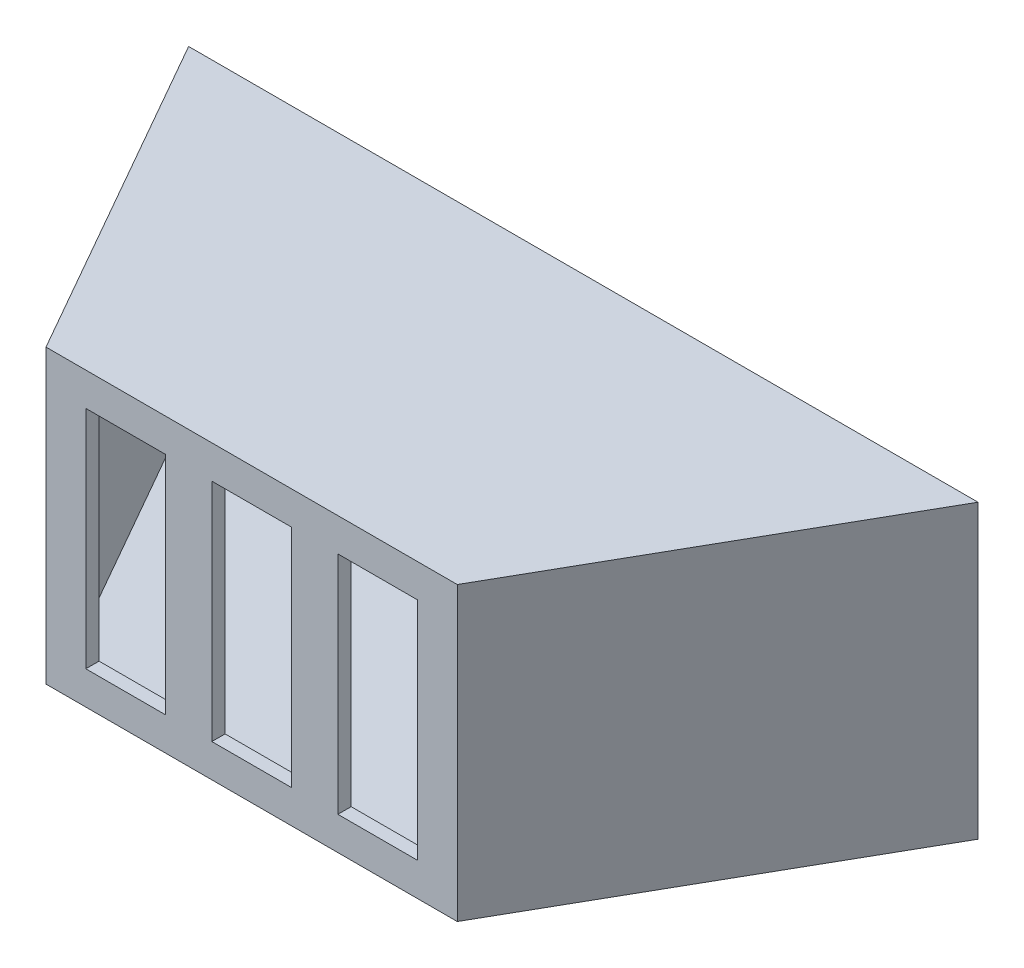
ISO-10303-21;
HEADER;
FILE_DESCRIPTION(('STEP AP214'),'2;1');
FILE_NAME('part.step','',(''),(''),'','','');
FILE_SCHEMA(('AUTOMOTIVE_DESIGN { 1 0 10303 214 1 1 1 1 }'));
ENDSEC;
DATA;
#1=APPLICATION_CONTEXT('core data for automotive mechanical design processes');
#2=APPLICATION_PROTOCOL_DEFINITION('international standard','automotive_design',2000,#1);
#3=PRODUCT_CONTEXT('',#1,'mechanical');
#4=PRODUCT('Part','Part','',(#3));
#5=PRODUCT_RELATED_PRODUCT_CATEGORY('part','',(#4));
#6=PRODUCT_DEFINITION_FORMATION('','',#4);
#7=PRODUCT_DEFINITION_CONTEXT('part definition',#1,'design');
#8=PRODUCT_DEFINITION('design','',#6,#7);
#9=PRODUCT_DEFINITION_SHAPE('','',#8);
#10=(LENGTH_UNIT() NAMED_UNIT(*) SI_UNIT(.MILLI.,.METRE.));
#11=(NAMED_UNIT(*) PLANE_ANGLE_UNIT() SI_UNIT($,.RADIAN.));
#12=(NAMED_UNIT(*) SI_UNIT($,.STERADIAN.) SOLID_ANGLE_UNIT());
#13=UNCERTAINTY_MEASURE_WITH_UNIT(LENGTH_MEASURE(1.E-05),#10,'distance_accuracy_value','');
#14=(GEOMETRIC_REPRESENTATION_CONTEXT(3) GLOBAL_UNCERTAINTY_ASSIGNED_CONTEXT((#13)) GLOBAL_UNIT_ASSIGNED_CONTEXT((#10,
#11,#12)) REPRESENTATION_CONTEXT('',''));
#15=CARTESIAN_POINT('',(0.,0.,0.));
#16=DIRECTION('',(0.,0.,1.));
#17=DIRECTION('',(1.,0.,0.));
#18=AXIS2_PLACEMENT_3D('',#15,#16,#17);
#19=CARTESIAN_POINT('',(42.1979139894435,-13.2970585407784,-42.323641575713));
#20=DIRECTION('',(0.,0.,1.));
#21=DIRECTION('',(1.,0.,0.));
#22=AXIS2_PLACEMENT_3D('',#19,#20,#21);
#23=PLANE('',#22);
#24=CARTESIAN_POINT('',(49.5,10.,-42.323641575713));
#25=DIRECTION('',(0.,0.,-1.));
#26=DIRECTION('',(-1.,0.,0.));
#27=AXIS2_PLACEMENT_3D('',#24,#25,#26);
#28=CIRCLE('',#27,5.25);
#29=CARTESIAN_POINT('',(44.25,10.,-42.323641575713));
#30=VERTEX_POINT('',#29);
#31=EDGE_CURVE('E299',#30,#30,#28,.T.);
#32=ORIENTED_EDGE('',*,*,#31,.T.);
#33=EDGE_LOOP('',(#32));
#34=FACE_BOUND('',#33,.T.);
#35=DIRECTION('',(-1.,0.,0.));
#36=VECTOR('',#35,1.);
#37=CARTESIAN_POINT('',(42.1979139894435,2.,-42.323641575713));
#38=LINE('',#37,#36);
#39=CARTESIAN_POINT('',(55.4879139894435,2.,-42.323641575713));
#40=VERTEX_POINT('',#39);
#41=CARTESIAN_POINT('',(42.1979139894435,2.,-42.323641575713));
#42=VERTEX_POINT('',#41);
#43=EDGE_CURVE('E322',#40,#42,#38,.T.);
#44=ORIENTED_EDGE('',*,*,#43,.F.);
#45=DIRECTION('',(0.,1.,0.));
#46=VECTOR('',#45,1.);
#47=CARTESIAN_POINT('',(55.4879139894435,-13.2970585407784,-42.323641575713));
#48=LINE('',#47,#46);
#49=CARTESIAN_POINT('',(55.4879139894435,42.,-42.323641575713));
#50=VERTEX_POINT('',#49);
#51=EDGE_CURVE('E323',#40,#50,#48,.T.);
#52=ORIENTED_EDGE('',*,*,#51,.T.);
#53=DIRECTION('',(1.,0.,0.));
#54=VECTOR('',#53,1.);
#55=CARTESIAN_POINT('',(42.1979139894435,42.,-42.323641575713));
#56=LINE('',#55,#54);
#57=CARTESIAN_POINT('',(42.1979139894435,42.,-42.323641575713));
#58=VERTEX_POINT('',#57);
#59=EDGE_CURVE('E317',#58,#50,#56,.T.);
#60=ORIENTED_EDGE('',*,*,#59,.F.);
#61=DIRECTION('',(0.,1.,0.));
#62=VECTOR('',#61,1.);
#63=CARTESIAN_POINT('',(42.1979139894435,-13.2970585407784,-42.323641575713));
#64=LINE('',#63,#62);
#65=EDGE_CURVE('E332',#42,#58,#64,.T.);
#66=ORIENTED_EDGE('',*,*,#65,.F.);
#67=EDGE_LOOP('',(#44,#52,#60,#66));
#68=FACE_BOUND('',#67,.T.);
#69=CARTESIAN_POINT('',(49.5,34.,-42.323641575713));
#70=DIRECTION('',(0.,0.,-1.));
#71=DIRECTION('',(-1.,0.,0.));
#72=AXIS2_PLACEMENT_3D('',#69,#70,#71);
#73=CIRCLE('',#72,5.25);
#74=CARTESIAN_POINT('',(44.25,34.,-42.323641575713));
#75=VERTEX_POINT('',#74);
#76=EDGE_CURVE('E289',#75,#75,#73,.T.);
#77=ORIENTED_EDGE('',*,*,#76,.T.);
#78=EDGE_LOOP('',(#77));
#79=FACE_BOUND('',#78,.T.);
#80=ADVANCED_FACE('F34',(#34,#68,#79),#23,.T.);
#81=CARTESIAN_POINT('',(-57.7624454596147,44.,-46.3140476637326));
#82=DIRECTION('',(0.868777270192661,0.,-0.495203044009817));
#83=DIRECTION('',(-0.495203044009817,0.,-0.868777270192661));
#84=AXIS2_PLACEMENT_3D('',#81,#82,#83);
#85=PLANE('',#84);
#86=DIRECTION('',(0.495203044009817,0.,0.868777270192661));
#87=VECTOR('',#86,1.);
#88=CARTESIAN_POINT('',(-57.7624454596147,2.,-46.3140476637326));
#89=LINE('',#88,#87);
#90=CARTESIAN_POINT('',(-55.4879139894435,2.,-42.323641575713));
#91=VERTEX_POINT('',#90);
#92=CARTESIAN_POINT('',(-29.8379139894435,2.,2.67635842428699));
#93=VERTEX_POINT('',#92);
#94=EDGE_CURVE('E357',#91,#93,#89,.T.);
#95=ORIENTED_EDGE('',*,*,#94,.F.);
#96=DIRECTION('',(0.,1.,0.));
#97=VECTOR('',#96,1.);
#98=CARTESIAN_POINT('',(-55.4879139894435,-13.2970585407784,-42.323641575713));
#99=LINE('',#98,#97);
#100=CARTESIAN_POINT('',(-55.4879139894435,42.,-42.323641575713));
#101=VERTEX_POINT('',#100);
#102=EDGE_CURVE('E347',#91,#101,#99,.T.);
#103=ORIENTED_EDGE('',*,*,#102,.T.);
#104=DIRECTION('',(0.495203044009817,0.,0.868777270192661));
#105=VECTOR('',#104,1.);
#106=CARTESIAN_POINT('',(-57.7624454596147,42.,-46.3140476637326));
#107=LINE('',#106,#105);
#108=CARTESIAN_POINT('',(-29.8379139894435,42.,2.67635842428699));
#109=VERTEX_POINT('',#108);
#110=EDGE_CURVE('E365',#101,#109,#107,.T.);
#111=ORIENTED_EDGE('',*,*,#110,.T.);
#112=DIRECTION('',(0.,-1.,0.));
#113=VECTOR('',#112,1.);
#114=CARTESIAN_POINT('',(-29.8379139894435,44.,2.67635842428699));
#115=LINE('',#114,#113);
#116=EDGE_CURVE('E360',#109,#93,#115,.T.);
#117=ORIENTED_EDGE('',*,*,#116,.T.);
#118=EDGE_LOOP('',(#95,#103,#111,#117));
#119=FACE_BOUND('',#118,.T.);
#120=ADVANCED_FACE('F435',(#119),#85,.T.);
#121=CARTESIAN_POINT('',(-59.5,42.,-45.323641575713));
#122=DIRECTION('',(0.,1.,0.));
#123=DIRECTION('',(0.,0.,1.));
#124=AXIS2_PLACEMENT_3D('',#121,#122,#123);
#125=PLANE('',#124);
#126=DIRECTION('',(0.,0.,1.));
#127=VECTOR('',#126,1.);
#128=CARTESIAN_POINT('',(42.1979139894435,42.,-45.323641575713));
#129=LINE('',#128,#127);
#130=CARTESIAN_POINT('',(42.1979139894435,42.,-45.323641575713));
#131=VERTEX_POINT('',#130);
#132=EDGE_CURVE('E327',#131,#58,#129,.T.);
#133=ORIENTED_EDGE('',*,*,#132,.T.);
#134=ORIENTED_EDGE('',*,*,#59,.T.);
#135=DIRECTION('',(0.495203044009817,0.,-0.868777270192661));
#136=VECTOR('',#135,1.);
#137=CARTESIAN_POINT('',(29.2624454596147,42.,3.68595233626735));
#138=LINE('',#137,#136);
#139=CARTESIAN_POINT('',(29.8379139894435,42.,2.67635842428699));
#140=VERTEX_POINT('',#139);
#141=EDGE_CURVE('E373',#140,#50,#138,.T.);
#142=ORIENTED_EDGE('',*,*,#141,.F.);
#143=DIRECTION('',(1.,0.,0.));
#144=VECTOR('',#143,1.);
#145=CARTESIAN_POINT('',(-31.,42.,2.67635842428699));
#146=LINE('',#145,#144);
#147=EDGE_CURVE('E367',#109,#140,#146,.T.);
#148=ORIENTED_EDGE('',*,*,#147,.F.);
#149=ORIENTED_EDGE('',*,*,#110,.F.);
#150=DIRECTION('',(-1.,0.,0.));
#151=VECTOR('',#150,1.);
#152=CARTESIAN_POINT('',(-42.1979139894435,42.,-42.323641575713));
#153=LINE('',#152,#151);
#154=CARTESIAN_POINT('',(-42.1979139894435,42.,-42.323641575713));
#155=VERTEX_POINT('',#154);
#156=EDGE_CURVE('E344',#155,#101,#153,.T.);
#157=ORIENTED_EDGE('',*,*,#156,.F.);
#158=DIRECTION('',(0.,0.,1.));
#159=VECTOR('',#158,1.);
#160=CARTESIAN_POINT('',(-42.1979139894435,42.,-45.323641575713));
#161=LINE('',#160,#159);
#162=CARTESIAN_POINT('',(-42.1979139894435,42.,-45.323641575713));
#163=VERTEX_POINT('',#162);
#164=EDGE_CURVE('E325',#163,#155,#161,.T.);
#165=ORIENTED_EDGE('',*,*,#164,.F.);
#166=DIRECTION('',(-1.,0.,0.));
#167=VECTOR('',#166,1.);
#168=CARTESIAN_POINT('',(59.5,42.,-45.323641575713));
#169=LINE('',#168,#167);
#170=EDGE_CURVE('E368',#131,#163,#169,.T.);
#171=ORIENTED_EDGE('',*,*,#170,.F.);
#172=EDGE_LOOP('',(#133,#134,#142,#148,#149,#157,#165,#171));
#173=FACE_BOUND('',#172,.T.);
#174=ADVANCED_FACE('F441',(#173),#125,.F.);
#175=CARTESIAN_POINT('',(-59.5,2.,-45.323641575713));
#176=DIRECTION('',(0.,1.,0.));
#177=DIRECTION('',(0.,0.,1.));
#178=AXIS2_PLACEMENT_3D('',#175,#176,#177);
#179=PLANE('',#178);
#180=ORIENTED_EDGE('',*,*,#43,.T.);
#181=DIRECTION('',(0.,0.,-1.));
#182=VECTOR('',#181,1.);
#183=CARTESIAN_POINT('',(42.1979139894435,2.,-45.323641575713));
#184=LINE('',#183,#182);
#185=CARTESIAN_POINT('',(42.1979139894435,2.,-45.323641575713));
#186=VERTEX_POINT('',#185);
#187=EDGE_CURVE('E320',#42,#186,#184,.T.);
#188=ORIENTED_EDGE('',*,*,#187,.T.);
#189=DIRECTION('',(-1.,0.,0.));
#190=VECTOR('',#189,1.);
#191=CARTESIAN_POINT('',(59.5,2.,-45.323641575713));
#192=LINE('',#191,#190);
#193=CARTESIAN_POINT('',(-42.1979139894435,2.,-45.323641575713));
#194=VERTEX_POINT('',#193);
#195=EDGE_CURVE('E340',#186,#194,#192,.T.);
#196=ORIENTED_EDGE('',*,*,#195,.T.);
#197=DIRECTION('',(0.,0.,-1.));
#198=VECTOR('',#197,1.);
#199=CARTESIAN_POINT('',(-42.1979139894435,2.,-45.323641575713));
#200=LINE('',#199,#198);
#201=CARTESIAN_POINT('',(-42.1979139894435,2.,-42.323641575713));
#202=VERTEX_POINT('',#201);
#203=EDGE_CURVE('E337',#202,#194,#200,.T.);
#204=ORIENTED_EDGE('',*,*,#203,.F.);
#205=DIRECTION('',(1.,0.,0.));
#206=VECTOR('',#205,1.);
#207=CARTESIAN_POINT('',(-42.1979139894435,2.,-42.323641575713));
#208=LINE('',#207,#206);
#209=EDGE_CURVE('E341',#91,#202,#208,.T.);
#210=ORIENTED_EDGE('',*,*,#209,.F.);
#211=ORIENTED_EDGE('',*,*,#94,.T.);
#212=DIRECTION('',(1.,0.,0.));
#213=VECTOR('',#212,1.);
#214=CARTESIAN_POINT('',(-31.,2.,2.67635842428699));
#215=LINE('',#214,#213);
#216=CARTESIAN_POINT('',(29.8379139894435,2.,2.67635842428699));
#217=VERTEX_POINT('',#216);
#218=EDGE_CURVE('E359',#93,#217,#215,.T.);
#219=ORIENTED_EDGE('',*,*,#218,.T.);
#220=DIRECTION('',(0.495203044009817,0.,-0.868777270192661));
#221=VECTOR('',#220,1.);
#222=CARTESIAN_POINT('',(29.2624454596147,2.,3.68595233626735));
#223=LINE('',#222,#221);
#224=EDGE_CURVE('E370',#217,#40,#223,.T.);
#225=ORIENTED_EDGE('',*,*,#224,.T.);
#226=EDGE_LOOP('',(#180,#188,#196,#204,#210,#211,#219,#225));
#227=FACE_BOUND('',#226,.T.);
#228=ADVANCED_FACE('F432',(#227),#179,.T.);
#229=CARTESIAN_POINT('',(59.5,44.,-45.323641575713));
#230=DIRECTION('',(0.,0.,1.));
#231=DIRECTION('',(1.,0.,0.));
#232=AXIS2_PLACEMENT_3D('',#229,#230,#231);
#233=PLANE('',#232);
#234=DIRECTION('',(0.,1.,0.));
#235=VECTOR('',#234,1.);
#236=CARTESIAN_POINT('',(42.1979139894435,-13.2970585407784,-45.323641575713));
#237=LINE('',#236,#235);
#238=EDGE_CURVE('E329',#186,#131,#237,.T.);
#239=ORIENTED_EDGE('',*,*,#238,.T.);
#240=ORIENTED_EDGE('',*,*,#170,.T.);
#241=DIRECTION('',(0.,1.,0.));
#242=VECTOR('',#241,1.);
#243=CARTESIAN_POINT('',(-42.1979139894435,-13.2970585407784,-45.323641575713));
#244=LINE('',#243,#242);
#245=EDGE_CURVE('E352',#194,#163,#244,.T.);
#246=ORIENTED_EDGE('',*,*,#245,.F.);
#247=ORIENTED_EDGE('',*,*,#195,.F.);
#248=EDGE_LOOP('',(#239,#240,#246,#247));
#249=FACE_BOUND('',#248,.T.);
#250=DIRECTION('',(-1.,0.,0.));
#251=VECTOR('',#250,1.);
#252=CARTESIAN_POINT('',(59.5,0.,-45.323641575713));
#253=LINE('',#252,#251);
#254=CARTESIAN_POINT('',(59.5,0.,-45.323641575713));
#255=VERTEX_POINT('',#254);
#256=CARTESIAN_POINT('',(-59.5,0.,-45.323641575713));
#257=VERTEX_POINT('',#256);
#258=EDGE_CURVE('E363',#255,#257,#253,.T.);
#259=ORIENTED_EDGE('',*,*,#258,.T.);
#260=DIRECTION('',(0.,-1.,0.));
#261=VECTOR('',#260,1.);
#262=CARTESIAN_POINT('',(-59.5,44.,-45.323641575713));
#263=LINE('',#262,#261);
#264=CARTESIAN_POINT('',(-59.5,44.,-45.323641575713));
#265=VERTEX_POINT('',#264);
#266=EDGE_CURVE('E11',#265,#257,#263,.T.);
#267=ORIENTED_EDGE('',*,*,#266,.F.);
#268=DIRECTION('',(-1.,0.,0.));
#269=VECTOR('',#268,1.);
#270=CARTESIAN_POINT('',(59.5,44.,-45.323641575713));
#271=LINE('',#270,#269);
#272=CARTESIAN_POINT('',(59.5,44.,-45.323641575713));
#273=VERTEX_POINT('',#272);
#274=EDGE_CURVE('E381',#273,#265,#271,.T.);
#275=ORIENTED_EDGE('',*,*,#274,.F.);
#276=DIRECTION('',(0.,-1.,0.));
#277=VECTOR('',#276,1.);
#278=CARTESIAN_POINT('',(59.5,44.,-45.323641575713));
#279=LINE('',#278,#277);
#280=EDGE_CURVE('E391',#273,#255,#279,.T.);
#281=ORIENTED_EDGE('',*,*,#280,.T.);
#282=EDGE_LOOP('',(#259,#267,#275,#281));
#283=FACE_BOUND('',#282,.T.);
#284=ADVANCED_FACE('F36',(#249,#283),#233,.F.);
#285=CARTESIAN_POINT('',(-59.5,44.,-45.323641575713));
#286=DIRECTION('',(0.868777270192661,0.,-0.495203044009817));
#287=DIRECTION('',(-0.495203044009817,0.,-0.868777270192661));
#288=AXIS2_PLACEMENT_3D('',#285,#286,#287);
#289=PLANE('',#288);
#290=DIRECTION('',(0.495203044009817,0.,0.868777270192661));
#291=VECTOR('',#290,1.);
#292=CARTESIAN_POINT('',(-59.5,0.,-45.323641575713));
#293=LINE('',#292,#291);
#294=CARTESIAN_POINT('',(-31.,0.,4.67635842428699));
#295=VERTEX_POINT('',#294);
#296=EDGE_CURVE('E394',#257,#295,#293,.T.);
#297=ORIENTED_EDGE('',*,*,#296,.T.);
#298=DIRECTION('',(0.,-1.,0.));
#299=VECTOR('',#298,1.);
#300=CARTESIAN_POINT('',(-31.,44.,4.67635842428699));
#301=LINE('',#300,#299);
#302=CARTESIAN_POINT('',(-31.,44.,4.67635842428699));
#303=VERTEX_POINT('',#302);
#304=EDGE_CURVE('E42',#303,#295,#301,.T.);
#305=ORIENTED_EDGE('',*,*,#304,.F.);
#306=DIRECTION('',(0.495203044009817,0.,0.868777270192661));
#307=VECTOR('',#306,1.);
#308=CARTESIAN_POINT('',(-59.5,44.,-45.323641575713));
#309=LINE('',#308,#307);
#310=EDGE_CURVE('E384',#265,#303,#309,.T.);
#311=ORIENTED_EDGE('',*,*,#310,.F.);
#312=ORIENTED_EDGE('',*,*,#266,.T.);
#313=EDGE_LOOP('',(#297,#305,#311,#312));
#314=FACE_BOUND('',#313,.T.);
#315=ADVANCED_FACE('F424',(#314),#289,.F.);
#316=CARTESIAN_POINT('',(-31.,44.,4.67635842428699));
#317=DIRECTION('',(0.,0.,-1.));
#318=DIRECTION('',(-1.,0.,0.));
#319=AXIS2_PLACEMENT_3D('',#316,#317,#318);
#320=PLANE('',#319);
#321=DIRECTION('',(1.,0.,0.));
#322=VECTOR('',#321,1.);
#323=CARTESIAN_POINT('',(-25.,5.,4.67635842428699));
#324=LINE('',#323,#322);
#325=CARTESIAN_POINT('',(-25.,5.,4.67635842428699));
#326=VERTEX_POINT('',#325);
#327=CARTESIAN_POINT('',(-13.,5.,4.67635842428699));
#328=VERTEX_POINT('',#327);
#329=EDGE_CURVE('E222',#326,#328,#324,.T.);
#330=ORIENTED_EDGE('',*,*,#329,.F.);
#331=DIRECTION('',(0.,-1.,0.));
#332=VECTOR('',#331,1.);
#333=CARTESIAN_POINT('',(-25.,39.,4.67635842428699));
#334=LINE('',#333,#332);
#335=CARTESIAN_POINT('',(-25.,39.,4.67635842428699));
#336=VERTEX_POINT('',#335);
#337=EDGE_CURVE('E49',#336,#326,#334,.T.);
#338=ORIENTED_EDGE('',*,*,#337,.F.);
#339=DIRECTION('',(-1.,0.,0.));
#340=VECTOR('',#339,1.);
#341=CARTESIAN_POINT('',(-25.,39.,4.67635842428699));
#342=LINE('',#341,#340);
#343=CARTESIAN_POINT('',(-13.,39.,4.67635842428699));
#344=VERTEX_POINT('',#343);
#345=EDGE_CURVE('E213',#344,#336,#342,.T.);
#346=ORIENTED_EDGE('',*,*,#345,.F.);
#347=DIRECTION('',(0.,1.,0.));
#348=VECTOR('',#347,1.);
#349=CARTESIAN_POINT('',(-13.,39.,4.67635842428699));
#350=LINE('',#349,#348);
#351=EDGE_CURVE('E216',#328,#344,#350,.T.);
#352=ORIENTED_EDGE('',*,*,#351,.F.);
#353=EDGE_LOOP('',(#330,#338,#346,#352));
#354=FACE_BOUND('',#353,.T.);
#355=DIRECTION('',(1.,0.,0.));
#356=VECTOR('',#355,1.);
#357=CARTESIAN_POINT('',(13.,5.,4.67635842428699));
#358=LINE('',#357,#356);
#359=CARTESIAN_POINT('',(13.,4.99999999999999,4.67635842428699));
#360=VERTEX_POINT('',#359);
#361=CARTESIAN_POINT('',(25.,5.,4.67635842428699));
#362=VERTEX_POINT('',#361);
#363=EDGE_CURVE('E247',#360,#362,#358,.T.);
#364=ORIENTED_EDGE('',*,*,#363,.F.);
#365=DIRECTION('',(0.,-1.,0.));
#366=VECTOR('',#365,1.);
#367=CARTESIAN_POINT('',(13.,39.,4.67635842428699));
#368=LINE('',#367,#366);
#369=CARTESIAN_POINT('',(13.,39.,4.67635842428699));
#370=VERTEX_POINT('',#369);
#371=EDGE_CURVE('E228',#370,#360,#368,.T.);
#372=ORIENTED_EDGE('',*,*,#371,.F.);
#373=DIRECTION('',(-1.,0.,0.));
#374=VECTOR('',#373,1.);
#375=CARTESIAN_POINT('',(13.,39.,4.67635842428699));
#376=LINE('',#375,#374);
#377=CARTESIAN_POINT('',(25.,39.,4.67635842428699));
#378=VERTEX_POINT('',#377);
#379=EDGE_CURVE('E236',#378,#370,#376,.T.);
#380=ORIENTED_EDGE('',*,*,#379,.F.);
#381=DIRECTION('',(0.,1.,0.));
#382=VECTOR('',#381,1.);
#383=CARTESIAN_POINT('',(25.,39.,4.67635842428699));
#384=LINE('',#383,#382);
#385=EDGE_CURVE('E250',#362,#378,#384,.T.);
#386=ORIENTED_EDGE('',*,*,#385,.F.);
#387=EDGE_LOOP('',(#364,#372,#380,#386));
#388=FACE_BOUND('',#387,.T.);
#389=DIRECTION('',(1.,0.,0.));
#390=VECTOR('',#389,1.);
#391=CARTESIAN_POINT('',(-6.,5.,4.67635842428699));
#392=LINE('',#391,#390);
#393=CARTESIAN_POINT('',(-5.99999999999999,5.,4.67635842428699));
#394=VERTEX_POINT('',#393);
#395=CARTESIAN_POINT('',(6.,5.,4.67635842428699));
#396=VERTEX_POINT('',#395);
#397=EDGE_CURVE('E279',#394,#396,#392,.T.);
#398=ORIENTED_EDGE('',*,*,#397,.F.);
#399=DIRECTION('',(0.,-1.,0.));
#400=VECTOR('',#399,1.);
#401=CARTESIAN_POINT('',(-6.,39.,4.67635842428699));
#402=LINE('',#401,#400);
#403=CARTESIAN_POINT('',(-6.,39.,4.67635842428699));
#404=VERTEX_POINT('',#403);
#405=EDGE_CURVE('E257',#404,#394,#402,.T.);
#406=ORIENTED_EDGE('',*,*,#405,.F.);
#407=DIRECTION('',(-1.,0.,0.));
#408=VECTOR('',#407,1.);
#409=CARTESIAN_POINT('',(-6.,39.,4.67635842428699));
#410=LINE('',#409,#408);
#411=CARTESIAN_POINT('',(6.,39.,4.67635842428699));
#412=VERTEX_POINT('',#411);
#413=EDGE_CURVE('E268',#412,#404,#410,.T.);
#414=ORIENTED_EDGE('',*,*,#413,.F.);
#415=DIRECTION('',(0.,1.,0.));
#416=VECTOR('',#415,1.);
#417=CARTESIAN_POINT('',(6.,39.,4.67635842428699));
#418=LINE('',#417,#416);
#419=EDGE_CURVE('E282',#396,#412,#418,.T.);
#420=ORIENTED_EDGE('',*,*,#419,.F.);
#421=EDGE_LOOP('',(#398,#406,#414,#420));
#422=FACE_BOUND('',#421,.T.);
#423=DIRECTION('',(1.,0.,0.));
#424=VECTOR('',#423,1.);
#425=CARTESIAN_POINT('',(-31.,0.,4.67635842428699));
#426=LINE('',#425,#424);
#427=CARTESIAN_POINT('',(31.,0.,4.67635842428699));
#428=VERTEX_POINT('',#427);
#429=EDGE_CURVE('E396',#295,#428,#426,.T.);
#430=ORIENTED_EDGE('',*,*,#429,.T.);
#431=DIRECTION('',(0.,-1.,0.));
#432=VECTOR('',#431,1.);
#433=CARTESIAN_POINT('',(31.,44.,4.67635842428699));
#434=LINE('',#433,#432);
#435=CARTESIAN_POINT('',(31.,44.,4.67635842428699));
#436=VERTEX_POINT('',#435);
#437=EDGE_CURVE('E401',#436,#428,#434,.T.);
#438=ORIENTED_EDGE('',*,*,#437,.F.);
#439=DIRECTION('',(1.,0.,0.));
#440=VECTOR('',#439,1.);
#441=CARTESIAN_POINT('',(-31.,44.,4.67635842428699));
#442=LINE('',#441,#440);
#443=EDGE_CURVE('E387',#303,#436,#442,.T.);
#444=ORIENTED_EDGE('',*,*,#443,.F.);
#445=ORIENTED_EDGE('',*,*,#304,.T.);
#446=EDGE_LOOP('',(#430,#438,#444,#445));
#447=FACE_BOUND('',#446,.T.);
#448=ADVANCED_FACE('F408',(#354,#388,#422,#447),#320,.F.);
#449=CARTESIAN_POINT('',(31.,44.,4.67635842428699));
#450=DIRECTION('',(-0.868777270192661,0.,-0.495203044009817));
#451=DIRECTION('',(-0.495203044009817,0.,0.868777270192661));
#452=AXIS2_PLACEMENT_3D('',#449,#450,#451);
#453=PLANE('',#452);
#454=DIRECTION('',(0.495203044009817,0.,-0.868777270192661));
#455=VECTOR('',#454,1.);
#456=CARTESIAN_POINT('',(31.,0.,4.67635842428699));
#457=LINE('',#456,#455);
#458=EDGE_CURVE('E385',#428,#255,#457,.T.);
#459=ORIENTED_EDGE('',*,*,#458,.T.);
#460=ORIENTED_EDGE('',*,*,#280,.F.);
#461=DIRECTION('',(0.495203044009817,0.,-0.868777270192661));
#462=VECTOR('',#461,1.);
#463=CARTESIAN_POINT('',(31.,44.,4.67635842428699));
#464=LINE('',#463,#462);
#465=EDGE_CURVE('E389',#436,#273,#464,.T.);
#466=ORIENTED_EDGE('',*,*,#465,.F.);
#467=ORIENTED_EDGE('',*,*,#437,.T.);
#468=EDGE_LOOP('',(#459,#460,#466,#467));
#469=FACE_BOUND('',#468,.T.);
#470=ADVANCED_FACE('F417',(#469),#453,.F.);
#471=CARTESIAN_POINT('',(-59.5,44.,-45.323641575713));
#472=DIRECTION('',(0.,1.,0.));
#473=DIRECTION('',(0.,0.,1.));
#474=AXIS2_PLACEMENT_3D('',#471,#472,#473);
#475=PLANE('',#474);
#476=ORIENTED_EDGE('',*,*,#274,.T.);
#477=ORIENTED_EDGE('',*,*,#310,.T.);
#478=ORIENTED_EDGE('',*,*,#443,.T.);
#479=ORIENTED_EDGE('',*,*,#465,.T.);
#480=EDGE_LOOP('',(#476,#477,#478,#479));
#481=FACE_BOUND('',#480,.T.);
#482=ADVANCED_FACE('F423',(#481),#475,.T.);
#483=CARTESIAN_POINT('',(-59.5,0.,-45.323641575713));
#484=DIRECTION('',(0.,1.,0.));
#485=DIRECTION('',(0.,0.,1.));
#486=AXIS2_PLACEMENT_3D('',#483,#484,#485);
#487=PLANE('',#486);
#488=ORIENTED_EDGE('',*,*,#258,.F.);
#489=ORIENTED_EDGE('',*,*,#458,.F.);
#490=ORIENTED_EDGE('',*,*,#429,.F.);
#491=ORIENTED_EDGE('',*,*,#296,.F.);
#492=EDGE_LOOP('',(#488,#489,#490,#491));
#493=FACE_BOUND('',#492,.T.);
#494=ADVANCED_FACE('F414',(#493),#487,.F.);
#495=CARTESIAN_POINT('',(-31.,44.,2.67635842428699));
#496=DIRECTION('',(0.,0.,-1.));
#497=DIRECTION('',(-1.,0.,0.));
#498=AXIS2_PLACEMENT_3D('',#495,#496,#497);
#499=PLANE('',#498);
#500=DIRECTION('',(0.,-1.,0.));
#501=VECTOR('',#500,1.);
#502=CARTESIAN_POINT('',(-25.,39.,2.67635842428699));
#503=LINE('',#502,#501);
#504=CARTESIAN_POINT('',(-25.,39.,2.67635842428699));
#505=VERTEX_POINT('',#504);
#506=CARTESIAN_POINT('',(-25.,5.,2.67635842428699));
#507=VERTEX_POINT('',#506);
#508=EDGE_CURVE('E197',#505,#507,#503,.T.);
#509=ORIENTED_EDGE('',*,*,#508,.T.);
#510=DIRECTION('',(1.,0.,0.));
#511=VECTOR('',#510,1.);
#512=CARTESIAN_POINT('',(-25.,5.,2.67635842428699));
#513=LINE('',#512,#511);
#514=CARTESIAN_POINT('',(-13.,5.,2.67635842428699));
#515=VERTEX_POINT('',#514);
#516=EDGE_CURVE('E206',#507,#515,#513,.T.);
#517=ORIENTED_EDGE('',*,*,#516,.T.);
#518=DIRECTION('',(0.,1.,0.));
#519=VECTOR('',#518,1.);
#520=CARTESIAN_POINT('',(-13.,39.,2.67635842428699));
#521=LINE('',#520,#519);
#522=CARTESIAN_POINT('',(-13.,39.,2.67635842428699));
#523=VERTEX_POINT('',#522);
#524=EDGE_CURVE('E57',#515,#523,#521,.T.);
#525=ORIENTED_EDGE('',*,*,#524,.T.);
#526=DIRECTION('',(-1.,0.,0.));
#527=VECTOR('',#526,1.);
#528=CARTESIAN_POINT('',(-25.,39.,2.67635842428699));
#529=LINE('',#528,#527);
#530=EDGE_CURVE('E203',#523,#505,#529,.T.);
#531=ORIENTED_EDGE('',*,*,#530,.T.);
#532=EDGE_LOOP('',(#509,#517,#525,#531));
#533=FACE_BOUND('',#532,.T.);
#534=DIRECTION('',(0.,-1.,0.));
#535=VECTOR('',#534,1.);
#536=CARTESIAN_POINT('',(13.,39.,2.67635842428699));
#537=LINE('',#536,#535);
#538=CARTESIAN_POINT('',(13.,39.,2.67635842428699));
#539=VERTEX_POINT('',#538);
#540=CARTESIAN_POINT('',(13.,5.,2.67635842428699));
#541=VERTEX_POINT('',#540);
#542=EDGE_CURVE('E232',#539,#541,#537,.T.);
#543=ORIENTED_EDGE('',*,*,#542,.T.);
#544=DIRECTION('',(1.,0.,0.));
#545=VECTOR('',#544,1.);
#546=CARTESIAN_POINT('',(13.,5.,2.67635842428699));
#547=LINE('',#546,#545);
#548=CARTESIAN_POINT('',(25.,4.99999999999999,2.67635842428699));
#549=VERTEX_POINT('',#548);
#550=EDGE_CURVE('E235',#541,#549,#547,.T.);
#551=ORIENTED_EDGE('',*,*,#550,.T.);
#552=DIRECTION('',(0.,1.,0.));
#553=VECTOR('',#552,1.);
#554=CARTESIAN_POINT('',(25.,39.,2.67635842428699));
#555=LINE('',#554,#553);
#556=CARTESIAN_POINT('',(25.,39.,2.67635842428699));
#557=VERTEX_POINT('',#556);
#558=EDGE_CURVE('E239',#549,#557,#555,.T.);
#559=ORIENTED_EDGE('',*,*,#558,.T.);
#560=DIRECTION('',(-1.,0.,0.));
#561=VECTOR('',#560,1.);
#562=CARTESIAN_POINT('',(13.,39.,2.67635842428699));
#563=LINE('',#562,#561);
#564=EDGE_CURVE('E242',#557,#539,#563,.T.);
#565=ORIENTED_EDGE('',*,*,#564,.T.);
#566=EDGE_LOOP('',(#543,#551,#559,#565));
#567=FACE_BOUND('',#566,.T.);
#568=DIRECTION('',(0.,-1.,0.));
#569=VECTOR('',#568,1.);
#570=CARTESIAN_POINT('',(-6.,39.,2.67635842428699));
#571=LINE('',#570,#569);
#572=CARTESIAN_POINT('',(-6.,39.,2.67635842428699));
#573=VERTEX_POINT('',#572);
#574=CARTESIAN_POINT('',(-6.,5.,2.67635842428699));
#575=VERTEX_POINT('',#574);
#576=EDGE_CURVE('E264',#573,#575,#571,.T.);
#577=ORIENTED_EDGE('',*,*,#576,.T.);
#578=DIRECTION('',(1.,0.,0.));
#579=VECTOR('',#578,1.);
#580=CARTESIAN_POINT('',(-6.,5.,2.67635842428699));
#581=LINE('',#580,#579);
#582=CARTESIAN_POINT('',(6.,4.99999999999999,2.67635842428699));
#583=VERTEX_POINT('',#582);
#584=EDGE_CURVE('E267',#575,#583,#581,.T.);
#585=ORIENTED_EDGE('',*,*,#584,.T.);
#586=DIRECTION('',(0.,1.,0.));
#587=VECTOR('',#586,1.);
#588=CARTESIAN_POINT('',(6.,39.,2.67635842428699));
#589=LINE('',#588,#587);
#590=CARTESIAN_POINT('',(6.,39.,2.67635842428699));
#591=VERTEX_POINT('',#590);
#592=EDGE_CURVE('E271',#583,#591,#589,.T.);
#593=ORIENTED_EDGE('',*,*,#592,.T.);
#594=DIRECTION('',(-1.,0.,0.));
#595=VECTOR('',#594,1.);
#596=CARTESIAN_POINT('',(-6.,39.,2.67635842428699));
#597=LINE('',#596,#595);
#598=EDGE_CURVE('E274',#591,#573,#597,.T.);
#599=ORIENTED_EDGE('',*,*,#598,.T.);
#600=EDGE_LOOP('',(#577,#585,#593,#599));
#601=FACE_BOUND('',#600,.T.);
#602=ORIENTED_EDGE('',*,*,#218,.F.);
#603=ORIENTED_EDGE('',*,*,#116,.F.);
#604=ORIENTED_EDGE('',*,*,#147,.T.);
#605=DIRECTION('',(0.,-1.,0.));
#606=VECTOR('',#605,1.);
#607=CARTESIAN_POINT('',(29.8379139894435,44.,2.67635842428699));
#608=LINE('',#607,#606);
#609=EDGE_CURVE('E364',#140,#217,#608,.T.);
#610=ORIENTED_EDGE('',*,*,#609,.T.);
#611=EDGE_LOOP('',(#602,#603,#604,#610));
#612=FACE_BOUND('',#611,.T.);
#613=ADVANCED_FACE('F210',(#533,#567,#601,#612),#499,.T.);
#614=CARTESIAN_POINT('',(29.2624454596147,44.,3.68595233626735));
#615=DIRECTION('',(-0.868777270192661,0.,-0.495203044009817));
#616=DIRECTION('',(-0.495203044009817,0.,0.868777270192661));
#617=AXIS2_PLACEMENT_3D('',#614,#615,#616);
#618=PLANE('',#617);
#619=ORIENTED_EDGE('',*,*,#51,.F.);
#620=ORIENTED_EDGE('',*,*,#224,.F.);
#621=ORIENTED_EDGE('',*,*,#609,.F.);
#622=ORIENTED_EDGE('',*,*,#141,.T.);
#623=EDGE_LOOP('',(#619,#620,#621,#622));
#624=FACE_BOUND('',#623,.T.);
#625=ADVANCED_FACE('F453',(#624),#618,.T.);
#626=CARTESIAN_POINT('',(-42.1979139894435,-13.2970585407784,-42.323641575713));
#627=DIRECTION('',(0.,0.,-1.));
#628=DIRECTION('',(-1.,0.,0.));
#629=AXIS2_PLACEMENT_3D('',#626,#627,#628);
#630=PLANE('',#629);
#631=CARTESIAN_POINT('',(-49.5,34.,-42.323641575713));
#632=DIRECTION('',(0.,0.,1.));
#633=DIRECTION('',(1.,0.,0.));
#634=AXIS2_PLACEMENT_3D('',#631,#632,#633);
#635=CIRCLE('',#634,5.25);
#636=CARTESIAN_POINT('',(-44.25,34.,-42.323641575713));
#637=VERTEX_POINT('',#636);
#638=EDGE_CURVE('E305',#637,#637,#635,.T.);
#639=ORIENTED_EDGE('',*,*,#638,.F.);
#640=EDGE_LOOP('',(#639));
#641=FACE_BOUND('',#640,.T.);
#642=CARTESIAN_POINT('',(-49.5,10.,-42.323641575713));
#643=DIRECTION('',(0.,0.,1.));
#644=DIRECTION('',(1.,0.,0.));
#645=AXIS2_PLACEMENT_3D('',#642,#643,#644);
#646=CIRCLE('',#645,5.25);
#647=CARTESIAN_POINT('',(-44.25,10.,-42.323641575713));
#648=VERTEX_POINT('',#647);
#649=EDGE_CURVE('E311',#648,#648,#646,.T.);
#650=ORIENTED_EDGE('',*,*,#649,.F.);
#651=EDGE_LOOP('',(#650));
#652=FACE_BOUND('',#651,.T.);
#653=ORIENTED_EDGE('',*,*,#102,.F.);
#654=ORIENTED_EDGE('',*,*,#209,.T.);
#655=DIRECTION('',(0.,1.,0.));
#656=VECTOR('',#655,1.);
#657=CARTESIAN_POINT('',(-42.1979139894435,-13.2970585407784,-42.323641575713));
#658=LINE('',#657,#656);
#659=EDGE_CURVE('E349',#202,#155,#658,.T.);
#660=ORIENTED_EDGE('',*,*,#659,.T.);
#661=ORIENTED_EDGE('',*,*,#156,.T.);
#662=EDGE_LOOP('',(#653,#654,#660,#661));
#663=FACE_BOUND('',#662,.T.);
#664=ADVANCED_FACE('F449',(#641,#652,#663),#630,.F.);
#665=CARTESIAN_POINT('',(-42.1979139894435,-13.2970585407784,-45.323641575713));
#666=DIRECTION('',(-1.,0.,0.));
#667=DIRECTION('',(0.,0.,1.));
#668=AXIS2_PLACEMENT_3D('',#665,#666,#667);
#669=PLANE('',#668);
#670=ORIENTED_EDGE('',*,*,#659,.F.);
#671=ORIENTED_EDGE('',*,*,#203,.T.);
#672=ORIENTED_EDGE('',*,*,#245,.T.);
#673=ORIENTED_EDGE('',*,*,#164,.T.);
#674=EDGE_LOOP('',(#670,#671,#672,#673));
#675=FACE_BOUND('',#674,.T.);
#676=ADVANCED_FACE('F452',(#675),#669,.F.);
#677=CARTESIAN_POINT('',(42.1979139894435,-13.2970585407784,-45.323641575713));
#678=DIRECTION('',(-1.,0.,0.));
#679=DIRECTION('',(0.,0.,1.));
#680=AXIS2_PLACEMENT_3D('',#677,#678,#679);
#681=PLANE('',#680);
#682=ORIENTED_EDGE('',*,*,#187,.F.);
#683=ORIENTED_EDGE('',*,*,#65,.T.);
#684=ORIENTED_EDGE('',*,*,#132,.F.);
#685=ORIENTED_EDGE('',*,*,#238,.F.);
#686=EDGE_LOOP('',(#682,#683,#684,#685));
#687=FACE_BOUND('',#686,.T.);
#688=ADVANCED_FACE('F447',(#687),#681,.T.);
#689=CARTESIAN_POINT('',(-49.5,10.,-44.323641575713));
#690=DIRECTION('',(0.,0.,1.));
#691=DIRECTION('',(1.,0.,0.));
#692=AXIS2_PLACEMENT_3D('',#689,#690,#691);
#693=CYLINDRICAL_SURFACE('',#692,5.25);
#694=CARTESIAN_POINT('',(-49.5,10.,-44.323641575713));
#695=DIRECTION('',(0.,0.,1.));
#696=DIRECTION('',(1.,0.,0.));
#697=AXIS2_PLACEMENT_3D('',#694,#695,#696);
#698=CIRCLE('',#697,5.25);
#699=CARTESIAN_POINT('',(-44.25,10.,-44.323641575713));
#700=VERTEX_POINT('',#699);
#701=EDGE_CURVE('E314',#700,#700,#698,.T.);
#702=ORIENTED_EDGE('',*,*,#701,.F.);
#703=EDGE_LOOP('',(#702));
#704=FACE_BOUND('',#703,.T.);
#705=ORIENTED_EDGE('',*,*,#649,.T.);
#706=EDGE_LOOP('',(#705));
#707=FACE_BOUND('',#706,.T.);
#708=ADVANCED_FACE('F514',(#704,#707),#693,.F.);
#709=CARTESIAN_POINT('',(-49.5,10.,-44.323641575713));
#710=DIRECTION('',(0.,0.,1.));
#711=DIRECTION('',(1.,0.,0.));
#712=AXIS2_PLACEMENT_3D('',#709,#710,#711);
#713=PLANE('',#712);
#714=ORIENTED_EDGE('',*,*,#701,.T.);
#715=EDGE_LOOP('',(#714));
#716=FACE_BOUND('',#715,.T.);
#717=ADVANCED_FACE('F521',(#716),#713,.T.);
#718=CARTESIAN_POINT('',(-49.5,34.,-44.323641575713));
#719=DIRECTION('',(0.,0.,1.));
#720=DIRECTION('',(1.,0.,0.));
#721=AXIS2_PLACEMENT_3D('',#718,#719,#720);
#722=CYLINDRICAL_SURFACE('',#721,5.25);
#723=CARTESIAN_POINT('',(-49.5,34.,-44.323641575713));
#724=DIRECTION('',(0.,0.,1.));
#725=DIRECTION('',(1.,0.,0.));
#726=AXIS2_PLACEMENT_3D('',#723,#724,#725);
#727=CIRCLE('',#726,5.25);
#728=CARTESIAN_POINT('',(-44.25,34.,-44.323641575713));
#729=VERTEX_POINT('',#728);
#730=EDGE_CURVE('E308',#729,#729,#727,.T.);
#731=ORIENTED_EDGE('',*,*,#730,.F.);
#732=EDGE_LOOP('',(#731));
#733=FACE_BOUND('',#732,.T.);
#734=ORIENTED_EDGE('',*,*,#638,.T.);
#735=EDGE_LOOP('',(#734));
#736=FACE_BOUND('',#735,.T.);
#737=ADVANCED_FACE('F527',(#733,#736),#722,.F.);
#738=CARTESIAN_POINT('',(-49.5,34.,-44.323641575713));
#739=DIRECTION('',(0.,0.,1.));
#740=DIRECTION('',(1.,0.,0.));
#741=AXIS2_PLACEMENT_3D('',#738,#739,#740);
#742=PLANE('',#741);
#743=ORIENTED_EDGE('',*,*,#730,.T.);
#744=EDGE_LOOP('',(#743));
#745=FACE_BOUND('',#744,.T.);
#746=ADVANCED_FACE('F534',(#745),#742,.T.);
#747=CARTESIAN_POINT('',(49.5,10.,-44.323641575713));
#748=DIRECTION('',(0.,0.,1.));
#749=DIRECTION('',(1.,0.,0.));
#750=AXIS2_PLACEMENT_3D('',#747,#748,#749);
#751=CYLINDRICAL_SURFACE('',#750,5.25);
#752=CARTESIAN_POINT('',(49.5,10.,-44.323641575713));
#753=DIRECTION('',(0.,0.,-1.));
#754=DIRECTION('',(-1.,0.,0.));
#755=AXIS2_PLACEMENT_3D('',#752,#753,#754);
#756=CIRCLE('',#755,5.25);
#757=CARTESIAN_POINT('',(44.25,10.,-44.323641575713));
#758=VERTEX_POINT('',#757);
#759=EDGE_CURVE('E302',#758,#758,#756,.T.);
#760=ORIENTED_EDGE('',*,*,#759,.T.);
#761=EDGE_LOOP('',(#760));
#762=FACE_BOUND('',#761,.T.);
#763=ORIENTED_EDGE('',*,*,#31,.F.);
#764=EDGE_LOOP('',(#763));
#765=FACE_BOUND('',#764,.T.);
#766=ADVANCED_FACE('F542',(#762,#765),#751,.F.);
#767=CARTESIAN_POINT('',(49.5,10.,-44.323641575713));
#768=DIRECTION('',(0.,0.,1.));
#769=DIRECTION('',(-1.,0.,0.));
#770=AXIS2_PLACEMENT_3D('',#767,#768,#769);
#771=PLANE('',#770);
#772=ORIENTED_EDGE('',*,*,#759,.F.);
#773=EDGE_LOOP('',(#772));
#774=FACE_BOUND('',#773,.T.);
#775=ADVANCED_FACE('F550',(#774),#771,.T.);
#776=CARTESIAN_POINT('',(49.5,34.,-44.323641575713));
#777=DIRECTION('',(0.,0.,1.));
#778=DIRECTION('',(1.,0.,0.));
#779=AXIS2_PLACEMENT_3D('',#776,#777,#778);
#780=CYLINDRICAL_SURFACE('',#779,5.25);
#781=CARTESIAN_POINT('',(49.5,34.,-44.323641575713));
#782=DIRECTION('',(0.,0.,-1.));
#783=DIRECTION('',(-1.,0.,0.));
#784=AXIS2_PLACEMENT_3D('',#781,#782,#783);
#785=CIRCLE('',#784,5.25);
#786=CARTESIAN_POINT('',(44.25,34.,-44.323641575713));
#787=VERTEX_POINT('',#786);
#788=EDGE_CURVE('E296',#787,#787,#785,.T.);
#789=ORIENTED_EDGE('',*,*,#788,.T.);
#790=EDGE_LOOP('',(#789));
#791=FACE_BOUND('',#790,.T.);
#792=ORIENTED_EDGE('',*,*,#76,.F.);
#793=EDGE_LOOP('',(#792));
#794=FACE_BOUND('',#793,.T.);
#795=ADVANCED_FACE('F558',(#791,#794),#780,.F.);
#796=CARTESIAN_POINT('',(49.5,34.,-44.323641575713));
#797=DIRECTION('',(0.,0.,1.));
#798=DIRECTION('',(-1.,0.,0.));
#799=AXIS2_PLACEMENT_3D('',#796,#797,#798);
#800=PLANE('',#799);
#801=ORIENTED_EDGE('',*,*,#788,.F.);
#802=EDGE_LOOP('',(#801));
#803=FACE_BOUND('',#802,.T.);
#804=ADVANCED_FACE('F566',(#803),#800,.T.);
#805=CARTESIAN_POINT('',(-6.,39.,2.67635842428699));
#806=DIRECTION('',(-1.,0.,0.));
#807=DIRECTION('',(0.,-1.,0.));
#808=AXIS2_PLACEMENT_3D('',#805,#806,#807);
#809=PLANE('',#808);
#810=ORIENTED_EDGE('',*,*,#405,.T.);
#811=DIRECTION('',(0.,0.,1.));
#812=VECTOR('',#811,1.);
#813=CARTESIAN_POINT('',(-6.,5.,2.67635842428699));
#814=LINE('',#813,#812);
#815=EDGE_CURVE('E277',#575,#394,#814,.T.);
#816=ORIENTED_EDGE('',*,*,#815,.F.);
#817=ORIENTED_EDGE('',*,*,#576,.F.);
#818=DIRECTION('',(0.,0.,1.));
#819=VECTOR('',#818,1.);
#820=CARTESIAN_POINT('',(-6.,39.,2.67635842428699));
#821=LINE('',#820,#819);
#822=EDGE_CURVE('E287',#573,#404,#821,.T.);
#823=ORIENTED_EDGE('',*,*,#822,.T.);
#824=EDGE_LOOP('',(#810,#816,#817,#823));
#825=FACE_BOUND('',#824,.T.);
#826=ADVANCED_FACE('F574',(#825),#809,.F.);
#827=CARTESIAN_POINT('',(-6.,39.,2.67635842428699));
#828=DIRECTION('',(0.,1.,0.));
#829=DIRECTION('',(0.,0.,1.));
#830=AXIS2_PLACEMENT_3D('',#827,#828,#829);
#831=PLANE('',#830);
#832=ORIENTED_EDGE('',*,*,#413,.T.);
#833=ORIENTED_EDGE('',*,*,#822,.F.);
#834=ORIENTED_EDGE('',*,*,#598,.F.);
#835=DIRECTION('',(0.,0.,1.));
#836=VECTOR('',#835,1.);
#837=CARTESIAN_POINT('',(6.,39.,2.67635842428699));
#838=LINE('',#837,#836);
#839=EDGE_CURVE('E290',#591,#412,#838,.T.);
#840=ORIENTED_EDGE('',*,*,#839,.T.);
#841=EDGE_LOOP('',(#832,#833,#834,#840));
#842=FACE_BOUND('',#841,.T.);
#843=ADVANCED_FACE('F581',(#842),#831,.F.);
#844=CARTESIAN_POINT('',(6.,39.,2.67635842428699));
#845=DIRECTION('',(1.,0.,0.));
#846=DIRECTION('',(0.,1.,0.));
#847=AXIS2_PLACEMENT_3D('',#844,#845,#846);
#848=PLANE('',#847);
#849=ORIENTED_EDGE('',*,*,#419,.T.);
#850=ORIENTED_EDGE('',*,*,#839,.F.);
#851=ORIENTED_EDGE('',*,*,#592,.F.);
#852=DIRECTION('',(0.,0.,1.));
#853=VECTOR('',#852,1.);
#854=CARTESIAN_POINT('',(6.,5.,2.67635842428699));
#855=LINE('',#854,#853);
#856=EDGE_CURVE('E292',#583,#396,#855,.T.);
#857=ORIENTED_EDGE('',*,*,#856,.T.);
#858=EDGE_LOOP('',(#849,#850,#851,#857));
#859=FACE_BOUND('',#858,.T.);
#860=ADVANCED_FACE('F589',(#859),#848,.F.);
#861=CARTESIAN_POINT('',(-6.,5.,2.67635842428699));
#862=DIRECTION('',(0.,-1.,0.));
#863=DIRECTION('',(1.,0.,0.));
#864=AXIS2_PLACEMENT_3D('',#861,#862,#863);
#865=PLANE('',#864);
#866=ORIENTED_EDGE('',*,*,#397,.T.);
#867=ORIENTED_EDGE('',*,*,#856,.F.);
#868=ORIENTED_EDGE('',*,*,#584,.F.);
#869=ORIENTED_EDGE('',*,*,#815,.T.);
#870=EDGE_LOOP('',(#866,#867,#868,#869));
#871=FACE_BOUND('',#870,.T.);
#872=ADVANCED_FACE('F597',(#871),#865,.F.);
#873=CARTESIAN_POINT('',(13.,39.,2.67635842428699));
#874=DIRECTION('',(-1.,0.,0.));
#875=DIRECTION('',(0.,-1.,0.));
#876=AXIS2_PLACEMENT_3D('',#873,#874,#875);
#877=PLANE('',#876);
#878=ORIENTED_EDGE('',*,*,#371,.T.);
#879=DIRECTION('',(0.,0.,1.));
#880=VECTOR('',#879,1.);
#881=CARTESIAN_POINT('',(13.,5.,2.67635842428699));
#882=LINE('',#881,#880);
#883=EDGE_CURVE('E245',#541,#360,#882,.T.);
#884=ORIENTED_EDGE('',*,*,#883,.F.);
#885=ORIENTED_EDGE('',*,*,#542,.F.);
#886=DIRECTION('',(0.,0.,1.));
#887=VECTOR('',#886,1.);
#888=CARTESIAN_POINT('',(13.,39.,2.67635842428699));
#889=LINE('',#888,#887);
#890=EDGE_CURVE('E255',#539,#370,#889,.T.);
#891=ORIENTED_EDGE('',*,*,#890,.T.);
#892=EDGE_LOOP('',(#878,#884,#885,#891));
#893=FACE_BOUND('',#892,.T.);
#894=ADVANCED_FACE('F605',(#893),#877,.F.);
#895=CARTESIAN_POINT('',(13.,39.,2.67635842428699));
#896=DIRECTION('',(0.,1.,0.));
#897=DIRECTION('',(0.,0.,1.));
#898=AXIS2_PLACEMENT_3D('',#895,#896,#897);
#899=PLANE('',#898);
#900=ORIENTED_EDGE('',*,*,#379,.T.);
#901=ORIENTED_EDGE('',*,*,#890,.F.);
#902=ORIENTED_EDGE('',*,*,#564,.F.);
#903=DIRECTION('',(0.,0.,1.));
#904=VECTOR('',#903,1.);
#905=CARTESIAN_POINT('',(25.,39.,2.67635842428699));
#906=LINE('',#905,#904);
#907=EDGE_CURVE('E258',#557,#378,#906,.T.);
#908=ORIENTED_EDGE('',*,*,#907,.T.);
#909=EDGE_LOOP('',(#900,#901,#902,#908));
#910=FACE_BOUND('',#909,.T.);
#911=ADVANCED_FACE('F613',(#910),#899,.F.);
#912=CARTESIAN_POINT('',(25.,39.,2.67635842428699));
#913=DIRECTION('',(1.,0.,0.));
#914=DIRECTION('',(0.,1.,0.));
#915=AXIS2_PLACEMENT_3D('',#912,#913,#914);
#916=PLANE('',#915);
#917=ORIENTED_EDGE('',*,*,#385,.T.);
#918=ORIENTED_EDGE('',*,*,#907,.F.);
#919=ORIENTED_EDGE('',*,*,#558,.F.);
#920=DIRECTION('',(0.,0.,1.));
#921=VECTOR('',#920,1.);
#922=CARTESIAN_POINT('',(25.,5.,2.67635842428699));
#923=LINE('',#922,#921);
#924=EDGE_CURVE('E260',#549,#362,#923,.T.);
#925=ORIENTED_EDGE('',*,*,#924,.T.);
#926=EDGE_LOOP('',(#917,#918,#919,#925));
#927=FACE_BOUND('',#926,.T.);
#928=ADVANCED_FACE('F621',(#927),#916,.F.);
#929=CARTESIAN_POINT('',(13.,5.,2.67635842428699));
#930=DIRECTION('',(0.,-1.,0.));
#931=DIRECTION('',(1.,0.,0.));
#932=AXIS2_PLACEMENT_3D('',#929,#930,#931);
#933=PLANE('',#932);
#934=ORIENTED_EDGE('',*,*,#363,.T.);
#935=ORIENTED_EDGE('',*,*,#924,.F.);
#936=ORIENTED_EDGE('',*,*,#550,.F.);
#937=ORIENTED_EDGE('',*,*,#883,.T.);
#938=EDGE_LOOP('',(#934,#935,#936,#937));
#939=FACE_BOUND('',#938,.T.);
#940=ADVANCED_FACE('F629',(#939),#933,.F.);
#941=CARTESIAN_POINT('',(-25.,39.,2.67635842428699));
#942=DIRECTION('',(-1.,0.,0.));
#943=DIRECTION('',(0.,-1.,0.));
#944=AXIS2_PLACEMENT_3D('',#941,#942,#943);
#945=PLANE('',#944);
#946=ORIENTED_EDGE('',*,*,#337,.T.);
#947=DIRECTION('',(0.,0.,1.));
#948=VECTOR('',#947,1.);
#949=CARTESIAN_POINT('',(-25.,5.,2.67635842428699));
#950=LINE('',#949,#948);
#951=EDGE_CURVE('E193',#507,#326,#950,.T.);
#952=ORIENTED_EDGE('',*,*,#951,.F.);
#953=ORIENTED_EDGE('',*,*,#508,.F.);
#954=DIRECTION('',(0.,0.,1.));
#955=VECTOR('',#954,1.);
#956=CARTESIAN_POINT('',(-25.,39.,2.67635842428699));
#957=LINE('',#956,#955);
#958=EDGE_CURVE('E226',#505,#336,#957,.T.);
#959=ORIENTED_EDGE('',*,*,#958,.T.);
#960=EDGE_LOOP('',(#946,#952,#953,#959));
#961=FACE_BOUND('',#960,.T.);
#962=ADVANCED_FACE('F195',(#961),#945,.F.);
#963=CARTESIAN_POINT('',(-25.,39.,2.67635842428699));
#964=DIRECTION('',(0.,1.,0.));
#965=DIRECTION('',(0.,0.,1.));
#966=AXIS2_PLACEMENT_3D('',#963,#964,#965);
#967=PLANE('',#966);
#968=ORIENTED_EDGE('',*,*,#345,.T.);
#969=ORIENTED_EDGE('',*,*,#958,.F.);
#970=ORIENTED_EDGE('',*,*,#530,.F.);
#971=DIRECTION('',(0.,0.,1.));
#972=VECTOR('',#971,1.);
#973=CARTESIAN_POINT('',(-13.,39.,2.67635842428699));
#974=LINE('',#973,#972);
#975=EDGE_CURVE('E229',#523,#344,#974,.T.);
#976=ORIENTED_EDGE('',*,*,#975,.T.);
#977=EDGE_LOOP('',(#968,#969,#970,#976));
#978=FACE_BOUND('',#977,.T.);
#979=ADVANCED_FACE('F644',(#978),#967,.F.);
#980=CARTESIAN_POINT('',(-13.,39.,2.67635842428699));
#981=DIRECTION('',(1.,0.,0.));
#982=DIRECTION('',(0.,1.,0.));
#983=AXIS2_PLACEMENT_3D('',#980,#981,#982);
#984=PLANE('',#983);
#985=ORIENTED_EDGE('',*,*,#351,.T.);
#986=ORIENTED_EDGE('',*,*,#975,.F.);
#987=ORIENTED_EDGE('',*,*,#524,.F.);
#988=DIRECTION('',(0.,0.,1.));
#989=VECTOR('',#988,1.);
#990=CARTESIAN_POINT('',(-13.,5.,2.67635842428699));
#991=LINE('',#990,#989);
#992=EDGE_CURVE('E202',#515,#328,#991,.T.);
#993=ORIENTED_EDGE('',*,*,#992,.T.);
#994=EDGE_LOOP('',(#985,#986,#987,#993));
#995=FACE_BOUND('',#994,.T.);
#996=ADVANCED_FACE('F651',(#995),#984,.F.);
#997=CARTESIAN_POINT('',(-25.,5.,2.67635842428699));
#998=DIRECTION('',(0.,-1.,0.));
#999=DIRECTION('',(0.,0.,-1.));
#1000=AXIS2_PLACEMENT_3D('',#997,#998,#999);
#1001=PLANE('',#1000);
#1002=ORIENTED_EDGE('',*,*,#329,.T.);
#1003=ORIENTED_EDGE('',*,*,#992,.F.);
#1004=ORIENTED_EDGE('',*,*,#516,.F.);
#1005=ORIENTED_EDGE('',*,*,#951,.T.);
#1006=EDGE_LOOP('',(#1002,#1003,#1004,#1005));
#1007=FACE_BOUND('',#1006,.T.);
#1008=ADVANCED_FACE('F207',(#1007),#1001,.F.);
#1009=CLOSED_SHELL('',(#80,#120,#174,#228,#284,#315,#448,#470,#482,#494,#613,#625,#664,#676,
#688,#708,#717,#737,#746,#766,#775,#795,#804,#826,#843,#860,#872,#894,#911,#928,#940,#962,#979,
#996,#1008));
#1010=MANIFOLD_SOLID_BREP('B2',#1009);
#1011=ADVANCED_BREP_SHAPE_REPRESENTATION('',(#18,#1010),#14);
#1012=SHAPE_DEFINITION_REPRESENTATION(#9,#1011);
ENDSEC;
END-ISO-10303-21;
